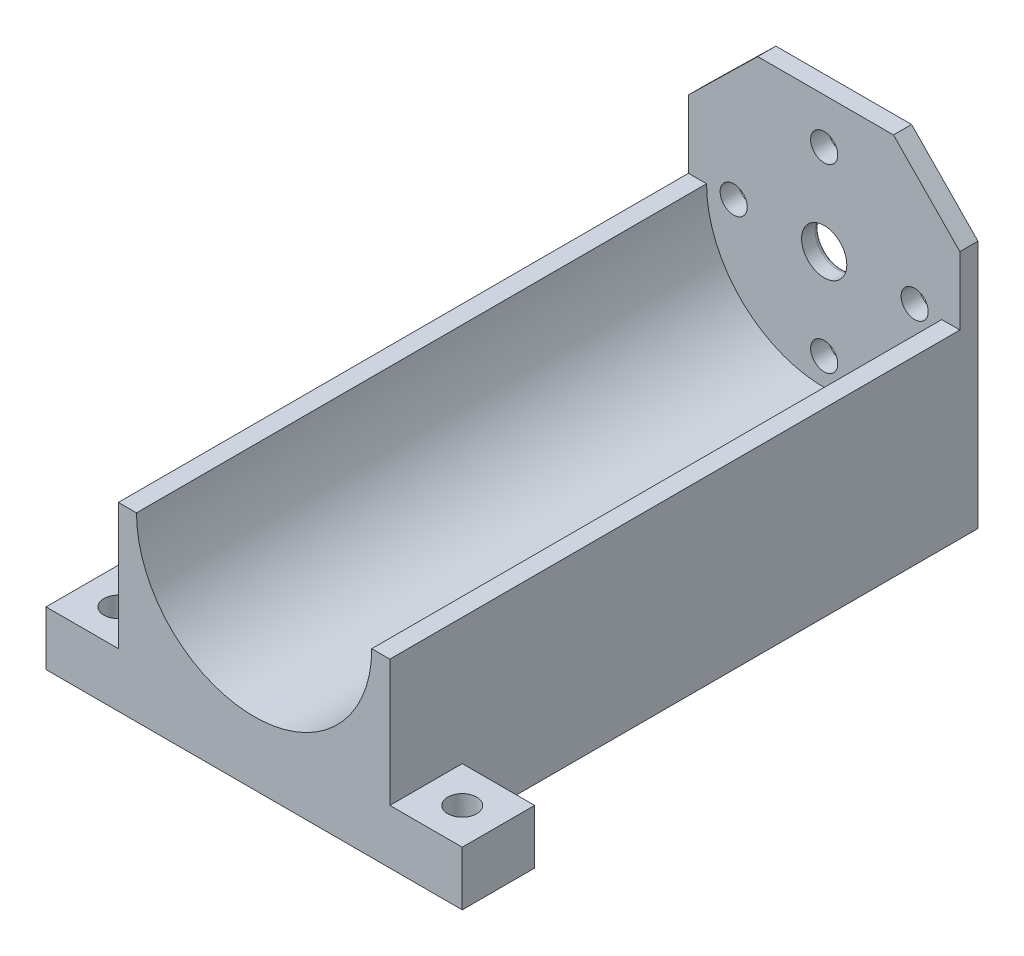
ISO-10303-21;
HEADER;
FILE_DESCRIPTION(('STEP AP214'),'2;1');
FILE_NAME('part.step','',(''),(''),'','','');
FILE_SCHEMA(('AUTOMOTIVE_DESIGN { 1 0 10303 214 1 1 1 1 }'));
ENDSEC;
DATA;
#1=APPLICATION_CONTEXT('core data for automotive mechanical design processes');
#2=APPLICATION_PROTOCOL_DEFINITION('international standard','automotive_design',2000,#1);
#3=PRODUCT_CONTEXT('',#1,'mechanical');
#4=PRODUCT('Part','Part','',(#3));
#5=PRODUCT_RELATED_PRODUCT_CATEGORY('part','',(#4));
#6=PRODUCT_DEFINITION_FORMATION('','',#4);
#7=PRODUCT_DEFINITION_CONTEXT('part definition',#1,'design');
#8=PRODUCT_DEFINITION('design','',#6,#7);
#9=PRODUCT_DEFINITION_SHAPE('','',#8);
#10=(LENGTH_UNIT() NAMED_UNIT(*) SI_UNIT(.MILLI.,.METRE.));
#11=(NAMED_UNIT(*) PLANE_ANGLE_UNIT() SI_UNIT($,.RADIAN.));
#12=(NAMED_UNIT(*) SI_UNIT($,.STERADIAN.) SOLID_ANGLE_UNIT());
#13=UNCERTAINTY_MEASURE_WITH_UNIT(LENGTH_MEASURE(1.E-05),#10,'distance_accuracy_value','');
#14=(GEOMETRIC_REPRESENTATION_CONTEXT(3) GLOBAL_UNCERTAINTY_ASSIGNED_CONTEXT((#13)) GLOBAL_UNIT_ASSIGNED_CONTEXT((#10,
#11,#12)) REPRESENTATION_CONTEXT('',''));
#15=CARTESIAN_POINT('',(0.,0.,0.));
#16=DIRECTION('',(0.,0.,1.));
#17=DIRECTION('',(1.,0.,0.));
#18=AXIS2_PLACEMENT_3D('',#15,#16,#17);
#19=CARTESIAN_POINT('',(15.,0.,2.));
#20=DIRECTION('',(1.,0.,0.));
#21=DIRECTION('',(0.,0.,-1.));
#22=AXIS2_PLACEMENT_3D('',#19,#20,#21);
#23=PLANE('',#22);
#24=DIRECTION('',(0.,0.,1.));
#25=VECTOR('',#24,1.);
#26=CARTESIAN_POINT('',(15.,-14.,0.));
#27=LINE('',#26,#25);
#28=CARTESIAN_POINT('',(15.,-14.,57.));
#29=VERTEX_POINT('',#28);
#30=CARTESIAN_POINT('',(15.,-14.,65.));
#31=VERTEX_POINT('',#30);
#32=EDGE_CURVE('E188',#29,#31,#27,.T.);
#33=ORIENTED_EDGE('',*,*,#32,.F.);
#34=DIRECTION('',(0.,-1.,0.));
#35=VECTOR('',#34,1.);
#36=CARTESIAN_POINT('',(15.,-14.,57.));
#37=LINE('',#36,#35);
#38=CARTESIAN_POINT('',(15.,-20.,57.));
#39=VERTEX_POINT('',#38);
#40=EDGE_CURVE('E191',#29,#39,#37,.T.);
#41=ORIENTED_EDGE('',*,*,#40,.T.);
#42=DIRECTION('',(0.,0.,-1.));
#43=VECTOR('',#42,1.);
#44=CARTESIAN_POINT('',(15.,-20.,65.));
#45=LINE('',#44,#43);
#46=CARTESIAN_POINT('',(15.,-20.,0.));
#47=VERTEX_POINT('',#46);
#48=EDGE_CURVE('E299',#39,#47,#45,.T.);
#49=ORIENTED_EDGE('',*,*,#48,.T.);
#50=DIRECTION('',(0.,-1.,0.));
#51=VECTOR('',#50,1.);
#52=CARTESIAN_POINT('',(15.,0.,0.));
#53=LINE('',#52,#51);
#54=CARTESIAN_POINT('',(15.,7.5,0.));
#55=VERTEX_POINT('',#54);
#56=EDGE_CURVE('E356',#55,#47,#53,.T.);
#57=ORIENTED_EDGE('',*,*,#56,.F.);
#58=DIRECTION('',(0.,0.,-1.));
#59=VECTOR('',#58,1.);
#60=CARTESIAN_POINT('',(15.,7.5,2.));
#61=LINE('',#60,#59);
#62=CARTESIAN_POINT('',(15.,7.5,2.));
#63=VERTEX_POINT('',#62);
#64=EDGE_CURVE('E375',#63,#55,#61,.T.);
#65=ORIENTED_EDGE('',*,*,#64,.F.);
#66=DIRECTION('',(0.,-1.,0.));
#67=VECTOR('',#66,1.);
#68=CARTESIAN_POINT('',(15.,0.,2.));
#69=LINE('',#68,#67);
#70=CARTESIAN_POINT('',(15.,0.,2.));
#71=VERTEX_POINT('',#70);
#72=EDGE_CURVE('E326',#63,#71,#69,.T.);
#73=ORIENTED_EDGE('',*,*,#72,.T.);
#74=DIRECTION('',(0.,0.,-1.));
#75=VECTOR('',#74,1.);
#76=CARTESIAN_POINT('',(15.,0.,65.));
#77=LINE('',#76,#75);
#78=CARTESIAN_POINT('',(15.,0.,65.));
#79=VERTEX_POINT('',#78);
#80=EDGE_CURVE('E301',#79,#71,#77,.T.);
#81=ORIENTED_EDGE('',*,*,#80,.F.);
#82=DIRECTION('',(0.,1.,0.));
#83=VECTOR('',#82,1.);
#84=CARTESIAN_POINT('',(15.,0.,65.));
#85=LINE('',#84,#83);
#86=EDGE_CURVE('E279',#31,#79,#85,.T.);
#87=ORIENTED_EDGE('',*,*,#86,.F.);
#88=EDGE_LOOP('',(#33,#41,#49,#57,#65,#73,#81,#87));
#89=FACE_BOUND('',#88,.T.);
#90=ADVANCED_FACE('F39',(#89),#23,.T.);
#91=CARTESIAN_POINT('',(11.4098237253435,11.1679362653464,2.));
#92=DIRECTION('',(0.714641377388513,0.699491030481627,0.));
#93=DIRECTION('',(-0.699491030481627,0.714641377388513,0.));
#94=AXIS2_PLACEMENT_3D('',#91,#92,#93);
#95=PLANE('',#94);
#96=DIRECTION('',(0.699491030481627,-0.714641377388513,0.));
#97=VECTOR('',#96,1.);
#98=CARTESIAN_POINT('',(11.4098237253435,11.1679362653464,0.));
#99=LINE('',#98,#97);
#100=CARTESIAN_POINT('',(7.65899947217843,15.,0.));
#101=VERTEX_POINT('',#100);
#102=EDGE_CURVE('E359',#101,#55,#99,.T.);
#103=ORIENTED_EDGE('',*,*,#102,.F.);
#104=DIRECTION('',(0.,0.,-1.));
#105=VECTOR('',#104,1.);
#106=CARTESIAN_POINT('',(7.65899947217843,15.,2.));
#107=LINE('',#106,#105);
#108=CARTESIAN_POINT('',(7.65899947217843,15.,2.));
#109=VERTEX_POINT('',#108);
#110=EDGE_CURVE('E373',#109,#101,#107,.T.);
#111=ORIENTED_EDGE('',*,*,#110,.F.);
#112=DIRECTION('',(0.699491030481627,-0.714641377388513,0.));
#113=VECTOR('',#112,1.);
#114=CARTESIAN_POINT('',(11.4098237253435,11.1679362653464,2.));
#115=LINE('',#114,#113);
#116=EDGE_CURVE('E329',#109,#63,#115,.T.);
#117=ORIENTED_EDGE('',*,*,#116,.T.);
#118=ORIENTED_EDGE('',*,*,#64,.T.);
#119=EDGE_LOOP('',(#103,#111,#117,#118));
#120=FACE_BOUND('',#119,.T.);
#121=ADVANCED_FACE('F398',(#120),#95,.T.);
#122=CARTESIAN_POINT('',(0.,15.,2.));
#123=DIRECTION('',(0.,1.,0.));
#124=DIRECTION('',(0.,0.,1.));
#125=AXIS2_PLACEMENT_3D('',#122,#123,#124);
#126=PLANE('',#125);
#127=DIRECTION('',(1.,0.,0.));
#128=VECTOR('',#127,1.);
#129=CARTESIAN_POINT('',(0.,15.,0.));
#130=LINE('',#129,#128);
#131=CARTESIAN_POINT('',(-7.34100052782156,15.,0.));
#132=VERTEX_POINT('',#131);
#133=EDGE_CURVE('E362',#132,#101,#130,.T.);
#134=ORIENTED_EDGE('',*,*,#133,.F.);
#135=DIRECTION('',(0.,0.,-1.));
#136=VECTOR('',#135,1.);
#137=CARTESIAN_POINT('',(-7.34100052782156,15.,2.));
#138=LINE('',#137,#136);
#139=CARTESIAN_POINT('',(-7.34100052782156,15.,2.));
#140=VERTEX_POINT('',#139);
#141=EDGE_CURVE('E371',#140,#132,#138,.T.);
#142=ORIENTED_EDGE('',*,*,#141,.F.);
#143=DIRECTION('',(1.,0.,0.));
#144=VECTOR('',#143,1.);
#145=CARTESIAN_POINT('',(0.,15.,2.));
#146=LINE('',#145,#144);
#147=EDGE_CURVE('E332',#140,#109,#146,.T.);
#148=ORIENTED_EDGE('',*,*,#147,.T.);
#149=ORIENTED_EDGE('',*,*,#110,.T.);
#150=EDGE_LOOP('',(#134,#142,#148,#149));
#151=FACE_BOUND('',#150,.T.);
#152=ADVANCED_FACE('F404',(#151),#126,.T.);
#153=CARTESIAN_POINT('',(-11.0918605271674,11.3270071897403,2.));
#154=DIRECTION('',(-0.699651605960082,0.714484170767609,0.));
#155=DIRECTION('',(-0.714484170767609,-0.699651605960082,0.));
#156=AXIS2_PLACEMENT_3D('',#153,#154,#155);
#157=PLANE('',#156);
#158=DIRECTION('',(0.714484170767609,0.699651605960082,0.));
#159=VECTOR('',#158,1.);
#160=CARTESIAN_POINT('',(-11.0918605271674,11.3270071897403,0.));
#161=LINE('',#160,#159);
#162=CARTESIAN_POINT('',(-15.,7.5,0.));
#163=VERTEX_POINT('',#162);
#164=EDGE_CURVE('E365',#163,#132,#161,.T.);
#165=ORIENTED_EDGE('',*,*,#164,.F.);
#166=DIRECTION('',(0.,0.,-1.));
#167=VECTOR('',#166,1.);
#168=CARTESIAN_POINT('',(-15.,7.5,2.));
#169=LINE('',#168,#167);
#170=CARTESIAN_POINT('',(-15.,7.5,2.));
#171=VERTEX_POINT('',#170);
#172=EDGE_CURVE('E344',#171,#163,#169,.T.);
#173=ORIENTED_EDGE('',*,*,#172,.F.);
#174=DIRECTION('',(0.714484170767609,0.699651605960082,0.));
#175=VECTOR('',#174,1.);
#176=CARTESIAN_POINT('',(-11.0918605271674,11.3270071897403,2.));
#177=LINE('',#176,#175);
#178=EDGE_CURVE('E335',#171,#140,#177,.T.);
#179=ORIENTED_EDGE('',*,*,#178,.T.);
#180=ORIENTED_EDGE('',*,*,#141,.T.);
#181=EDGE_LOOP('',(#165,#173,#179,#180));
#182=FACE_BOUND('',#181,.T.);
#183=ADVANCED_FACE('F469',(#182),#157,.T.);
#184=CARTESIAN_POINT('',(-15.,0.,2.));
#185=DIRECTION('',(-1.,0.,0.));
#186=DIRECTION('',(0.,0.,1.));
#187=AXIS2_PLACEMENT_3D('',#184,#185,#186);
#188=PLANE('',#187);
#189=DIRECTION('',(0.,-1.,0.));
#190=VECTOR('',#189,1.);
#191=CARTESIAN_POINT('',(-15.,-14.,57.));
#192=LINE('',#191,#190);
#193=CARTESIAN_POINT('',(-15.,-14.,57.));
#194=VERTEX_POINT('',#193);
#195=CARTESIAN_POINT('',(-15.,-20.,57.));
#196=VERTEX_POINT('',#195);
#197=EDGE_CURVE('E62',#194,#196,#192,.T.);
#198=ORIENTED_EDGE('',*,*,#197,.F.);
#199=DIRECTION('',(0.,0.,-1.));
#200=VECTOR('',#199,1.);
#201=CARTESIAN_POINT('',(-15.,-14.,0.));
#202=LINE('',#201,#200);
#203=CARTESIAN_POINT('',(-15.,-14.,65.));
#204=VERTEX_POINT('',#203);
#205=EDGE_CURVE('E218',#204,#194,#202,.T.);
#206=ORIENTED_EDGE('',*,*,#205,.F.);
#207=DIRECTION('',(0.,1.,0.));
#208=VECTOR('',#207,1.);
#209=CARTESIAN_POINT('',(-15.,0.,65.));
#210=LINE('',#209,#208);
#211=CARTESIAN_POINT('',(-15.,0.,65.));
#212=VERTEX_POINT('',#211);
#213=EDGE_CURVE('E283',#204,#212,#210,.T.);
#214=ORIENTED_EDGE('',*,*,#213,.T.);
#215=DIRECTION('',(0.,0.,-1.));
#216=VECTOR('',#215,1.);
#217=CARTESIAN_POINT('',(-15.,0.,65.));
#218=LINE('',#217,#216);
#219=CARTESIAN_POINT('',(-15.,0.,2.));
#220=VERTEX_POINT('',#219);
#221=EDGE_CURVE('E294',#212,#220,#218,.T.);
#222=ORIENTED_EDGE('',*,*,#221,.T.);
#223=DIRECTION('',(0.,1.,0.));
#224=VECTOR('',#223,1.);
#225=CARTESIAN_POINT('',(-15.,0.,2.));
#226=LINE('',#225,#224);
#227=EDGE_CURVE('E338',#220,#171,#226,.T.);
#228=ORIENTED_EDGE('',*,*,#227,.T.);
#229=ORIENTED_EDGE('',*,*,#172,.T.);
#230=DIRECTION('',(0.,1.,0.));
#231=VECTOR('',#230,1.);
#232=CARTESIAN_POINT('',(-15.,0.,0.));
#233=LINE('',#232,#231);
#234=CARTESIAN_POINT('',(-15.,-14.,0.));
#235=VERTEX_POINT('',#234);
#236=EDGE_CURVE('E309',#235,#163,#233,.T.);
#237=ORIENTED_EDGE('',*,*,#236,.F.);
#238=DIRECTION('',(0.,0.,-1.));
#239=VECTOR('',#238,1.);
#240=CARTESIAN_POINT('',(-15.,-14.,0.));
#241=LINE('',#240,#239);
#242=CARTESIAN_POINT('',(-15.,-14.,16.));
#243=VERTEX_POINT('',#242);
#244=EDGE_CURVE('E249',#243,#235,#241,.T.);
#245=ORIENTED_EDGE('',*,*,#244,.F.);
#246=DIRECTION('',(0.,-1.,0.));
#247=VECTOR('',#246,1.);
#248=CARTESIAN_POINT('',(-15.,-14.,16.));
#249=LINE('',#248,#247);
#250=CARTESIAN_POINT('',(-15.,-20.,16.));
#251=VERTEX_POINT('',#250);
#252=EDGE_CURVE('E266',#243,#251,#249,.T.);
#253=ORIENTED_EDGE('',*,*,#252,.T.);
#254=DIRECTION('',(0.,0.,-1.));
#255=VECTOR('',#254,1.);
#256=CARTESIAN_POINT('',(-15.,-20.,65.));
#257=LINE('',#256,#255);
#258=EDGE_CURVE('E297',#196,#251,#257,.T.);
#259=ORIENTED_EDGE('',*,*,#258,.F.);
#260=EDGE_LOOP('',(#198,#206,#214,#222,#228,#229,#237,#245,#253,#259));
#261=FACE_BOUND('',#260,.T.);
#262=ADVANCED_FACE('F413',(#261),#188,.T.);
#263=CARTESIAN_POINT('',(0.,10.,2.));
#264=DIRECTION('',(0.,0.,-1.));
#265=DIRECTION('',(-1.,0.,0.));
#266=AXIS2_PLACEMENT_3D('',#263,#264,#265);
#267=CYLINDRICAL_SURFACE('',#266,1.5);
#268=CARTESIAN_POINT('',(0.,10.,2.));
#269=DIRECTION('',(0.,0.,1.));
#270=DIRECTION('',(1.,0.,0.));
#271=AXIS2_PLACEMENT_3D('',#268,#269,#270);
#272=CIRCLE('',#271,1.5);
#273=CARTESIAN_POINT('',(1.5,10.,2.));
#274=VERTEX_POINT('',#273);
#275=EDGE_CURVE('E318',#274,#274,#272,.T.);
#276=ORIENTED_EDGE('',*,*,#275,.T.);
#277=EDGE_LOOP('',(#276));
#278=FACE_BOUND('',#277,.T.);
#279=CARTESIAN_POINT('',(0.,10.,0.));
#280=DIRECTION('',(0.,0.,1.));
#281=DIRECTION('',(1.,0.,0.));
#282=AXIS2_PLACEMENT_3D('',#279,#280,#281);
#283=CIRCLE('',#282,1.5);
#284=CARTESIAN_POINT('',(1.5,10.,0.));
#285=VERTEX_POINT('',#284);
#286=EDGE_CURVE('E353',#285,#285,#283,.T.);
#287=ORIENTED_EDGE('',*,*,#286,.F.);
#288=EDGE_LOOP('',(#287));
#289=FACE_BOUND('',#288,.T.);
#290=ADVANCED_FACE('F409',(#278,#289),#267,.F.);
#291=CARTESIAN_POINT('',(-10.,0.,2.));
#292=DIRECTION('',(0.,0.,-1.));
#293=DIRECTION('',(-1.,0.,0.));
#294=AXIS2_PLACEMENT_3D('',#291,#292,#293);
#295=CYLINDRICAL_SURFACE('',#294,1.5);
#296=CARTESIAN_POINT('',(-10.,0.,2.));
#297=DIRECTION('',(0.,0.,1.));
#298=DIRECTION('',(1.,0.,0.));
#299=AXIS2_PLACEMENT_3D('',#296,#297,#298);
#300=CIRCLE('',#299,1.5);
#301=CARTESIAN_POINT('',(-8.5,0.,2.));
#302=VERTEX_POINT('',#301);
#303=EDGE_CURVE('E315',#302,#302,#300,.T.);
#304=ORIENTED_EDGE('',*,*,#303,.T.);
#305=EDGE_LOOP('',(#304));
#306=FACE_BOUND('',#305,.T.);
#307=CARTESIAN_POINT('',(-10.,0.,0.));
#308=DIRECTION('',(0.,0.,1.));
#309=DIRECTION('',(1.,0.,0.));
#310=AXIS2_PLACEMENT_3D('',#307,#308,#309);
#311=CIRCLE('',#310,1.5);
#312=CARTESIAN_POINT('',(-8.5,0.,0.));
#313=VERTEX_POINT('',#312);
#314=EDGE_CURVE('E350',#313,#313,#311,.T.);
#315=ORIENTED_EDGE('',*,*,#314,.F.);
#316=EDGE_LOOP('',(#315));
#317=FACE_BOUND('',#316,.T.);
#318=ADVANCED_FACE('F412',(#306,#317),#295,.F.);
#319=CARTESIAN_POINT('',(10.,0.,2.));
#320=DIRECTION('',(0.,0.,-1.));
#321=DIRECTION('',(-1.,0.,0.));
#322=AXIS2_PLACEMENT_3D('',#319,#320,#321);
#323=CYLINDRICAL_SURFACE('',#322,1.5);
#324=CARTESIAN_POINT('',(10.,0.,2.));
#325=DIRECTION('',(0.,0.,1.));
#326=DIRECTION('',(1.,0.,0.));
#327=AXIS2_PLACEMENT_3D('',#324,#325,#326);
#328=CIRCLE('',#327,1.5);
#329=CARTESIAN_POINT('',(11.5,0.,2.));
#330=VERTEX_POINT('',#329);
#331=EDGE_CURVE('E312',#330,#330,#328,.T.);
#332=ORIENTED_EDGE('',*,*,#331,.T.);
#333=EDGE_LOOP('',(#332));
#334=FACE_BOUND('',#333,.T.);
#335=CARTESIAN_POINT('',(10.,0.,0.));
#336=DIRECTION('',(0.,0.,1.));
#337=DIRECTION('',(1.,0.,0.));
#338=AXIS2_PLACEMENT_3D('',#335,#336,#337);
#339=CIRCLE('',#338,1.5);
#340=CARTESIAN_POINT('',(11.5,0.,0.));
#341=VERTEX_POINT('',#340);
#342=EDGE_CURVE('E347',#341,#341,#339,.T.);
#343=ORIENTED_EDGE('',*,*,#342,.F.);
#344=EDGE_LOOP('',(#343));
#345=FACE_BOUND('',#344,.T.);
#346=ADVANCED_FACE('F417',(#334,#345),#323,.F.);
#347=CARTESIAN_POINT('',(0.,-10.,2.));
#348=DIRECTION('',(0.,0.,-1.));
#349=DIRECTION('',(-1.,0.,0.));
#350=AXIS2_PLACEMENT_3D('',#347,#348,#349);
#351=CYLINDRICAL_SURFACE('',#350,1.5);
#352=CARTESIAN_POINT('',(0.,-10.,2.));
#353=DIRECTION('',(0.,0.,1.));
#354=DIRECTION('',(1.,0.,0.));
#355=AXIS2_PLACEMENT_3D('',#352,#353,#354);
#356=CIRCLE('',#355,1.5);
#357=CARTESIAN_POINT('',(1.5,-10.,2.));
#358=VERTEX_POINT('',#357);
#359=EDGE_CURVE('E308',#358,#358,#356,.T.);
#360=ORIENTED_EDGE('',*,*,#359,.T.);
#361=EDGE_LOOP('',(#360));
#362=FACE_BOUND('',#361,.T.);
#363=CARTESIAN_POINT('',(0.,-10.,0.));
#364=DIRECTION('',(0.,0.,1.));
#365=DIRECTION('',(1.,0.,0.));
#366=AXIS2_PLACEMENT_3D('',#363,#364,#365);
#367=CIRCLE('',#366,1.5);
#368=CARTESIAN_POINT('',(1.5,-10.,0.));
#369=VERTEX_POINT('',#368);
#370=EDGE_CURVE('E293',#369,#369,#367,.T.);
#371=ORIENTED_EDGE('',*,*,#370,.F.);
#372=EDGE_LOOP('',(#371));
#373=FACE_BOUND('',#372,.T.);
#374=ADVANCED_FACE('F421',(#362,#373),#351,.F.);
#375=CARTESIAN_POINT('',(0.,0.,2.));
#376=DIRECTION('',(0.,0.,-1.));
#377=DIRECTION('',(-1.,0.,0.));
#378=AXIS2_PLACEMENT_3D('',#375,#376,#377);
#379=CYLINDRICAL_SURFACE('',#378,2.5);
#380=CARTESIAN_POINT('',(0.,0.,0.5));
#381=DIRECTION('',(0.,0.,1.));
#382=DIRECTION('',(1.,0.,0.));
#383=AXIS2_PLACEMENT_3D('',#380,#381,#382);
#384=CIRCLE('',#383,2.5);
#385=CARTESIAN_POINT('',(2.5,0.,0.5));
#386=VERTEX_POINT('',#385);
#387=EDGE_CURVE('E11',#386,#386,#384,.F.);
#388=ORIENTED_EDGE('',*,*,#387,.T.);
#389=EDGE_LOOP('',(#388));
#390=FACE_BOUND('',#389,.T.);
#391=CARTESIAN_POINT('',(0.,0.,2.));
#392=DIRECTION('',(0.,0.,1.));
#393=DIRECTION('',(1.,0.,0.));
#394=AXIS2_PLACEMENT_3D('',#391,#392,#393);
#395=CIRCLE('',#394,2.5);
#396=CARTESIAN_POINT('',(2.5,0.,2.));
#397=VERTEX_POINT('',#396);
#398=EDGE_CURVE('E305',#397,#397,#395,.T.);
#399=ORIENTED_EDGE('',*,*,#398,.T.);
#400=EDGE_LOOP('',(#399));
#401=FACE_BOUND('',#400,.T.);
#402=ADVANCED_FACE('F424',(#390,#401),#379,.F.);
#403=CARTESIAN_POINT('',(0.,0.,2.));
#404=DIRECTION('',(0.,0.,1.));
#405=DIRECTION('',(1.,0.,0.));
#406=AXIS2_PLACEMENT_3D('',#403,#404,#405);
#407=PLANE('',#406);
#408=ORIENTED_EDGE('',*,*,#398,.F.);
#409=EDGE_LOOP('',(#408));
#410=FACE_BOUND('',#409,.T.);
#411=ORIENTED_EDGE('',*,*,#359,.F.);
#412=EDGE_LOOP('',(#411));
#413=FACE_BOUND('',#412,.T.);
#414=ORIENTED_EDGE('',*,*,#331,.F.);
#415=EDGE_LOOP('',(#414));
#416=FACE_BOUND('',#415,.T.);
#417=ORIENTED_EDGE('',*,*,#303,.F.);
#418=EDGE_LOOP('',(#417));
#419=FACE_BOUND('',#418,.T.);
#420=ORIENTED_EDGE('',*,*,#275,.F.);
#421=EDGE_LOOP('',(#420));
#422=FACE_BOUND('',#421,.T.);
#423=CARTESIAN_POINT('',(0.,0.,2.));
#424=DIRECTION('',(0.,0.,1.));
#425=DIRECTION('',(1.,0.,0.));
#426=AXIS2_PLACEMENT_3D('',#423,#424,#425);
#427=CIRCLE('',#426,13.);
#428=CARTESIAN_POINT('',(-13.,0.,2.));
#429=VERTEX_POINT('',#428);
#430=CARTESIAN_POINT('',(13.,0.,2.));
#431=VERTEX_POINT('',#430);
#432=EDGE_CURVE('E321',#429,#431,#427,.T.);
#433=ORIENTED_EDGE('',*,*,#432,.T.);
#434=DIRECTION('',(-1.,0.,0.));
#435=VECTOR('',#434,1.);
#436=CARTESIAN_POINT('',(0.,0.,2.));
#437=LINE('',#436,#435);
#438=EDGE_CURVE('E324',#71,#431,#437,.T.);
#439=ORIENTED_EDGE('',*,*,#438,.F.);
#440=ORIENTED_EDGE('',*,*,#72,.F.);
#441=ORIENTED_EDGE('',*,*,#116,.F.);
#442=ORIENTED_EDGE('',*,*,#147,.F.);
#443=ORIENTED_EDGE('',*,*,#178,.F.);
#444=ORIENTED_EDGE('',*,*,#227,.F.);
#445=DIRECTION('',(1.,0.,0.));
#446=VECTOR('',#445,1.);
#447=CARTESIAN_POINT('',(0.,0.,2.));
#448=LINE('',#447,#446);
#449=EDGE_CURVE('E341',#220,#429,#448,.T.);
#450=ORIENTED_EDGE('',*,*,#449,.T.);
#451=EDGE_LOOP('',(#433,#439,#440,#441,#442,#443,#444,#450));
#452=FACE_BOUND('',#451,.T.);
#453=ADVANCED_FACE('F427',(#410,#413,#416,#419,#422,#452),#407,.T.);
#454=CARTESIAN_POINT('',(0.,0.,0.));
#455=DIRECTION('',(0.,0.,1.));
#456=DIRECTION('',(1.,0.,0.));
#457=AXIS2_PLACEMENT_3D('',#454,#455,#456);
#458=PLANE('',#457);
#459=CARTESIAN_POINT('',(0.,0.,0.));
#460=DIRECTION('',(0.,0.,1.));
#461=DIRECTION('',(1.,0.,0.));
#462=AXIS2_PLACEMENT_3D('',#459,#460,#461);
#463=CIRCLE('',#462,3.);
#464=CARTESIAN_POINT('',(3.,0.,0.));
#465=VERTEX_POINT('',#464);
#466=EDGE_CURVE('E47',#465,#465,#463,.T.);
#467=ORIENTED_EDGE('',*,*,#466,.T.);
#468=EDGE_LOOP('',(#467));
#469=FACE_BOUND('',#468,.T.);
#470=ORIENTED_EDGE('',*,*,#370,.T.);
#471=EDGE_LOOP('',(#470));
#472=FACE_BOUND('',#471,.T.);
#473=ORIENTED_EDGE('',*,*,#342,.T.);
#474=EDGE_LOOP('',(#473));
#475=FACE_BOUND('',#474,.T.);
#476=ORIENTED_EDGE('',*,*,#314,.T.);
#477=EDGE_LOOP('',(#476));
#478=FACE_BOUND('',#477,.T.);
#479=ORIENTED_EDGE('',*,*,#286,.T.);
#480=EDGE_LOOP('',(#479));
#481=FACE_BOUND('',#480,.T.);
#482=DIRECTION('',(-1.,0.,0.));
#483=VECTOR('',#482,1.);
#484=CARTESIAN_POINT('',(0.,-20.,0.));
#485=LINE('',#484,#483);
#486=CARTESIAN_POINT('',(-23.,-20.,0.));
#487=VERTEX_POINT('',#486);
#488=EDGE_CURVE('E269',#47,#487,#485,.T.);
#489=ORIENTED_EDGE('',*,*,#488,.T.);
#490=DIRECTION('',(0.,-1.,0.));
#491=VECTOR('',#490,1.);
#492=CARTESIAN_POINT('',(-23.,-14.,0.));
#493=LINE('',#492,#491);
#494=CARTESIAN_POINT('',(-23.,-14.,0.));
#495=VERTEX_POINT('',#494);
#496=EDGE_CURVE('E270',#495,#487,#493,.T.);
#497=ORIENTED_EDGE('',*,*,#496,.F.);
#498=DIRECTION('',(-1.,0.,0.));
#499=VECTOR('',#498,1.);
#500=CARTESIAN_POINT('',(0.,-14.,0.));
#501=LINE('',#500,#499);
#502=EDGE_CURVE('E247',#235,#495,#501,.T.);
#503=ORIENTED_EDGE('',*,*,#502,.F.);
#504=ORIENTED_EDGE('',*,*,#236,.T.);
#505=ORIENTED_EDGE('',*,*,#164,.T.);
#506=ORIENTED_EDGE('',*,*,#133,.T.);
#507=ORIENTED_EDGE('',*,*,#102,.T.);
#508=ORIENTED_EDGE('',*,*,#56,.T.);
#509=EDGE_LOOP('',(#489,#497,#503,#504,#505,#506,#507,#508));
#510=FACE_BOUND('',#509,.T.);
#511=ADVANCED_FACE('F379',(#469,#472,#475,#478,#481,#510),#458,.F.);
#512=CARTESIAN_POINT('',(0.,0.,65.));
#513=DIRECTION('',(0.,0.,-1.));
#514=DIRECTION('',(-1.,0.,0.));
#515=AXIS2_PLACEMENT_3D('',#512,#513,#514);
#516=CYLINDRICAL_SURFACE('',#515,13.);
#517=ORIENTED_EDGE('',*,*,#432,.F.);
#518=DIRECTION('',(0.,0.,-1.));
#519=VECTOR('',#518,1.);
#520=CARTESIAN_POINT('',(-13.,0.,65.));
#521=LINE('',#520,#519);
#522=CARTESIAN_POINT('',(-13.,0.,65.));
#523=VERTEX_POINT('',#522);
#524=EDGE_CURVE('E290',#523,#429,#521,.T.);
#525=ORIENTED_EDGE('',*,*,#524,.F.);
#526=CARTESIAN_POINT('',(0.,0.,65.));
#527=DIRECTION('',(0.,0.,-1.));
#528=DIRECTION('',(-1.,0.,0.));
#529=AXIS2_PLACEMENT_3D('',#526,#527,#528);
#530=CIRCLE('',#529,13.);
#531=CARTESIAN_POINT('',(13.,0.,65.));
#532=VERTEX_POINT('',#531);
#533=EDGE_CURVE('E274',#532,#523,#530,.T.);
#534=ORIENTED_EDGE('',*,*,#533,.F.);
#535=DIRECTION('',(0.,0.,-1.));
#536=VECTOR('',#535,1.);
#537=CARTESIAN_POINT('',(13.,0.,65.));
#538=LINE('',#537,#536);
#539=EDGE_CURVE('E288',#532,#431,#538,.T.);
#540=ORIENTED_EDGE('',*,*,#539,.T.);
#541=EDGE_LOOP('',(#517,#525,#534,#540));
#542=FACE_BOUND('',#541,.T.);
#543=ADVANCED_FACE('F450',(#542),#516,.F.);
#544=CARTESIAN_POINT('',(0.,0.,65.));
#545=DIRECTION('',(0.,-1.,0.));
#546=DIRECTION('',(0.,0.,-1.));
#547=AXIS2_PLACEMENT_3D('',#544,#545,#546);
#548=PLANE('',#547);
#549=ORIENTED_EDGE('',*,*,#449,.F.);
#550=ORIENTED_EDGE('',*,*,#221,.F.);
#551=DIRECTION('',(-1.,0.,0.));
#552=VECTOR('',#551,1.);
#553=CARTESIAN_POINT('',(0.,0.,65.));
#554=LINE('',#553,#552);
#555=EDGE_CURVE('E285',#523,#212,#554,.T.);
#556=ORIENTED_EDGE('',*,*,#555,.F.);
#557=ORIENTED_EDGE('',*,*,#524,.T.);
#558=EDGE_LOOP('',(#549,#550,#556,#557));
#559=FACE_BOUND('',#558,.T.);
#560=ADVANCED_FACE('F454',(#559),#548,.F.);
#561=CARTESIAN_POINT('',(0.,-20.,65.));
#562=DIRECTION('',(0.,-1.,0.));
#563=DIRECTION('',(0.,0.,-1.));
#564=AXIS2_PLACEMENT_3D('',#561,#562,#563);
#565=PLANE('',#564);
#566=ORIENTED_EDGE('',*,*,#488,.F.);
#567=ORIENTED_EDGE('',*,*,#48,.F.);
#568=DIRECTION('',(-1.,0.,0.));
#569=VECTOR('',#568,1.);
#570=CARTESIAN_POINT('',(0.,-20.,57.));
#571=LINE('',#570,#569);
#572=CARTESIAN_POINT('',(23.,-20.,57.));
#573=VERTEX_POINT('',#572);
#574=EDGE_CURVE('E54',#573,#39,#571,.T.);
#575=ORIENTED_EDGE('',*,*,#574,.F.);
#576=DIRECTION('',(0.,0.,-1.));
#577=VECTOR('',#576,1.);
#578=CARTESIAN_POINT('',(23.,-20.,0.));
#579=LINE('',#578,#577);
#580=CARTESIAN_POINT('',(23.,-20.,65.));
#581=VERTEX_POINT('',#580);
#582=EDGE_CURVE('E186',#581,#573,#579,.T.);
#583=ORIENTED_EDGE('',*,*,#582,.F.);
#584=DIRECTION('',(-1.,0.,0.));
#585=VECTOR('',#584,1.);
#586=CARTESIAN_POINT('',(0.,-20.,65.));
#587=LINE('',#586,#585);
#588=CARTESIAN_POINT('',(-23.,-20.,65.));
#589=VERTEX_POINT('',#588);
#590=EDGE_CURVE('E281',#581,#589,#587,.T.);
#591=ORIENTED_EDGE('',*,*,#590,.T.);
#592=DIRECTION('',(0.,0.,-1.));
#593=VECTOR('',#592,1.);
#594=CARTESIAN_POINT('',(-23.,-20.,0.));
#595=LINE('',#594,#593);
#596=CARTESIAN_POINT('',(-23.,-20.,57.));
#597=VERTEX_POINT('',#596);
#598=EDGE_CURVE('E226',#589,#597,#595,.T.);
#599=ORIENTED_EDGE('',*,*,#598,.T.);
#600=DIRECTION('',(1.,0.,0.));
#601=VECTOR('',#600,1.);
#602=CARTESIAN_POINT('',(0.,-20.,57.));
#603=LINE('',#602,#601);
#604=EDGE_CURVE('E212',#597,#196,#603,.T.);
#605=ORIENTED_EDGE('',*,*,#604,.T.);
#606=ORIENTED_EDGE('',*,*,#258,.T.);
#607=DIRECTION('',(-1.,0.,0.));
#608=VECTOR('',#607,1.);
#609=CARTESIAN_POINT('',(0.,-20.,16.));
#610=LINE('',#609,#608);
#611=CARTESIAN_POINT('',(-23.,-20.,16.));
#612=VERTEX_POINT('',#611);
#613=EDGE_CURVE('E258',#251,#612,#610,.T.);
#614=ORIENTED_EDGE('',*,*,#613,.T.);
#615=DIRECTION('',(0.,0.,-1.));
#616=VECTOR('',#615,1.);
#617=CARTESIAN_POINT('',(-23.,-20.,0.));
#618=LINE('',#617,#616);
#619=EDGE_CURVE('E261',#612,#487,#618,.T.);
#620=ORIENTED_EDGE('',*,*,#619,.T.);
#621=EDGE_LOOP('',(#566,#567,#575,#583,#591,#599,#605,#606,#614,#620));
#622=FACE_BOUND('',#621,.T.);
#623=CARTESIAN_POINT('',(-19.,-20.,12.));
#624=DIRECTION('',(0.,-1.,0.));
#625=DIRECTION('',(0.,0.,-1.));
#626=AXIS2_PLACEMENT_3D('',#623,#624,#625);
#627=CIRCLE('',#626,1.6);
#628=CARTESIAN_POINT('',(-19.,-20.,10.4));
#629=VERTEX_POINT('',#628);
#630=EDGE_CURVE('E234',#629,#629,#627,.T.);
#631=ORIENTED_EDGE('',*,*,#630,.F.);
#632=EDGE_LOOP('',(#631));
#633=FACE_BOUND('',#632,.T.);
#634=CARTESIAN_POINT('',(-19.,-20.,4.));
#635=DIRECTION('',(0.,-1.,0.));
#636=DIRECTION('',(0.,0.,-1.));
#637=AXIS2_PLACEMENT_3D('',#634,#635,#636);
#638=CIRCLE('',#637,1.6);
#639=CARTESIAN_POINT('',(-19.,-20.,2.4));
#640=VERTEX_POINT('',#639);
#641=EDGE_CURVE('E241',#640,#640,#638,.T.);
#642=ORIENTED_EDGE('',*,*,#641,.F.);
#643=EDGE_LOOP('',(#642));
#644=FACE_BOUND('',#643,.T.);
#645=CARTESIAN_POINT('',(-19.,-20.,61.));
#646=DIRECTION('',(0.,-1.,0.));
#647=DIRECTION('',(0.,0.,-1.));
#648=AXIS2_PLACEMENT_3D('',#645,#646,#647);
#649=CIRCLE('',#648,1.6);
#650=CARTESIAN_POINT('',(-19.,-20.,59.4));
#651=VERTEX_POINT('',#650);
#652=EDGE_CURVE('E206',#651,#651,#649,.T.);
#653=ORIENTED_EDGE('',*,*,#652,.F.);
#654=EDGE_LOOP('',(#653));
#655=FACE_BOUND('',#654,.T.);
#656=CARTESIAN_POINT('',(19.,-20.,61.));
#657=DIRECTION('',(0.,-1.,0.));
#658=DIRECTION('',(0.,0.,-1.));
#659=AXIS2_PLACEMENT_3D('',#656,#657,#658);
#660=CIRCLE('',#659,1.6);
#661=CARTESIAN_POINT('',(19.,-20.,59.4));
#662=VERTEX_POINT('',#661);
#663=EDGE_CURVE('E200',#662,#662,#660,.T.);
#664=ORIENTED_EDGE('',*,*,#663,.F.);
#665=EDGE_LOOP('',(#664));
#666=FACE_BOUND('',#665,.T.);
#667=ADVANCED_FACE('F483',(#622,#633,#644,#655,#666),#565,.T.);
#668=CARTESIAN_POINT('',(0.,0.,65.));
#669=DIRECTION('',(0.,-1.,0.));
#670=DIRECTION('',(0.,0.,-1.));
#671=AXIS2_PLACEMENT_3D('',#668,#669,#670);
#672=PLANE('',#671);
#673=ORIENTED_EDGE('',*,*,#438,.T.);
#674=ORIENTED_EDGE('',*,*,#539,.F.);
#675=DIRECTION('',(-1.,0.,0.));
#676=VECTOR('',#675,1.);
#677=CARTESIAN_POINT('',(0.,0.,65.));
#678=LINE('',#677,#676);
#679=EDGE_CURVE('E277',#79,#532,#678,.T.);
#680=ORIENTED_EDGE('',*,*,#679,.F.);
#681=ORIENTED_EDGE('',*,*,#80,.T.);
#682=EDGE_LOOP('',(#673,#674,#680,#681));
#683=FACE_BOUND('',#682,.T.);
#684=ADVANCED_FACE('F393',(#683),#672,.F.);
#685=CARTESIAN_POINT('',(0.,0.,65.));
#686=DIRECTION('',(0.,0.,-1.));
#687=DIRECTION('',(-1.,0.,0.));
#688=AXIS2_PLACEMENT_3D('',#685,#686,#687);
#689=PLANE('',#688);
#690=ORIENTED_EDGE('',*,*,#533,.T.);
#691=ORIENTED_EDGE('',*,*,#555,.T.);
#692=ORIENTED_EDGE('',*,*,#213,.F.);
#693=DIRECTION('',(-1.,0.,0.));
#694=VECTOR('',#693,1.);
#695=CARTESIAN_POINT('',(0.,-14.,65.));
#696=LINE('',#695,#694);
#697=CARTESIAN_POINT('',(-23.,-14.,65.));
#698=VERTEX_POINT('',#697);
#699=EDGE_CURVE('E220',#204,#698,#696,.T.);
#700=ORIENTED_EDGE('',*,*,#699,.T.);
#701=DIRECTION('',(0.,-1.,0.));
#702=VECTOR('',#701,1.);
#703=CARTESIAN_POINT('',(-23.,-14.,65.));
#704=LINE('',#703,#702);
#705=EDGE_CURVE('E231',#698,#589,#704,.T.);
#706=ORIENTED_EDGE('',*,*,#705,.T.);
#707=ORIENTED_EDGE('',*,*,#590,.F.);
#708=DIRECTION('',(0.,-1.,0.));
#709=VECTOR('',#708,1.);
#710=CARTESIAN_POINT('',(23.,-14.,65.));
#711=LINE('',#710,#709);
#712=CARTESIAN_POINT('',(23.,-14.,65.));
#713=VERTEX_POINT('',#712);
#714=EDGE_CURVE('E187',#713,#581,#711,.T.);
#715=ORIENTED_EDGE('',*,*,#714,.F.);
#716=DIRECTION('',(1.,0.,0.));
#717=VECTOR('',#716,1.);
#718=CARTESIAN_POINT('',(0.,-14.,65.));
#719=LINE('',#718,#717);
#720=EDGE_CURVE('E178',#31,#713,#719,.T.);
#721=ORIENTED_EDGE('',*,*,#720,.F.);
#722=ORIENTED_EDGE('',*,*,#86,.T.);
#723=ORIENTED_EDGE('',*,*,#679,.T.);
#724=EDGE_LOOP('',(#690,#691,#692,#700,#706,#707,#715,#721,#722,#723));
#725=FACE_BOUND('',#724,.T.);
#726=ADVANCED_FACE('F384',(#725),#689,.F.);
#727=CARTESIAN_POINT('',(0.,0.,0.5));
#728=DIRECTION('',(0.,0.,1.));
#729=DIRECTION('',(1.,0.,0.));
#730=AXIS2_PLACEMENT_3D('',#727,#728,#729);
#731=TOROIDAL_SURFACE('',#730,3.,0.5);
#732=ORIENTED_EDGE('',*,*,#387,.F.);
#733=EDGE_LOOP('',(#732));
#734=FACE_BOUND('',#733,.T.);
#735=ORIENTED_EDGE('',*,*,#466,.F.);
#736=EDGE_LOOP('',(#735));
#737=FACE_BOUND('',#736,.T.);
#738=ADVANCED_FACE('F41',(#734,#737),#731,.T.);
#739=CARTESIAN_POINT('',(0.,-14.,16.));
#740=DIRECTION('',(0.,0.,1.));
#741=DIRECTION('',(1.,0.,0.));
#742=AXIS2_PLACEMENT_3D('',#739,#740,#741);
#743=PLANE('',#742);
#744=ORIENTED_EDGE('',*,*,#613,.F.);
#745=ORIENTED_EDGE('',*,*,#252,.F.);
#746=DIRECTION('',(-1.,0.,0.));
#747=VECTOR('',#746,1.);
#748=CARTESIAN_POINT('',(0.,-14.,16.));
#749=LINE('',#748,#747);
#750=CARTESIAN_POINT('',(-23.,-14.,16.));
#751=VERTEX_POINT('',#750);
#752=EDGE_CURVE('E240',#243,#751,#749,.T.);
#753=ORIENTED_EDGE('',*,*,#752,.T.);
#754=DIRECTION('',(0.,-1.,0.));
#755=VECTOR('',#754,1.);
#756=CARTESIAN_POINT('',(-23.,-14.,16.));
#757=LINE('',#756,#755);
#758=EDGE_CURVE('E255',#751,#612,#757,.T.);
#759=ORIENTED_EDGE('',*,*,#758,.T.);
#760=EDGE_LOOP('',(#744,#745,#753,#759));
#761=FACE_BOUND('',#760,.T.);
#762=ADVANCED_FACE('F383',(#761),#743,.T.);
#763=CARTESIAN_POINT('',(-23.,-14.,0.));
#764=DIRECTION('',(-1.,0.,0.));
#765=DIRECTION('',(0.,0.,1.));
#766=AXIS2_PLACEMENT_3D('',#763,#764,#765);
#767=PLANE('',#766);
#768=ORIENTED_EDGE('',*,*,#619,.F.);
#769=ORIENTED_EDGE('',*,*,#758,.F.);
#770=DIRECTION('',(0.,0.,-1.));
#771=VECTOR('',#770,1.);
#772=CARTESIAN_POINT('',(-23.,-14.,0.));
#773=LINE('',#772,#771);
#774=EDGE_CURVE('E244',#751,#495,#773,.T.);
#775=ORIENTED_EDGE('',*,*,#774,.T.);
#776=ORIENTED_EDGE('',*,*,#496,.T.);
#777=EDGE_LOOP('',(#768,#769,#775,#776));
#778=FACE_BOUND('',#777,.T.);
#779=ADVANCED_FACE('F390',(#778),#767,.T.);
#780=CARTESIAN_POINT('',(-19.,-14.,12.));
#781=DIRECTION('',(0.,-1.,0.));
#782=DIRECTION('',(0.,0.,-1.));
#783=AXIS2_PLACEMENT_3D('',#780,#781,#782);
#784=CYLINDRICAL_SURFACE('',#783,1.6);
#785=CARTESIAN_POINT('',(-19.,-14.,12.));
#786=DIRECTION('',(0.,-1.,0.));
#787=DIRECTION('',(0.,0.,-1.));
#788=AXIS2_PLACEMENT_3D('',#785,#786,#787);
#789=CIRCLE('',#788,1.6);
#790=CARTESIAN_POINT('',(-19.,-14.,10.4));
#791=VERTEX_POINT('',#790);
#792=EDGE_CURVE('E237',#791,#791,#789,.T.);
#793=ORIENTED_EDGE('',*,*,#792,.F.);
#794=EDGE_LOOP('',(#793));
#795=FACE_BOUND('',#794,.T.);
#796=ORIENTED_EDGE('',*,*,#630,.T.);
#797=EDGE_LOOP('',(#796));
#798=FACE_BOUND('',#797,.T.);
#799=ADVANCED_FACE('F497',(#795,#798),#784,.F.);
#800=CARTESIAN_POINT('',(-19.,-14.,4.));
#801=DIRECTION('',(0.,-1.,0.));
#802=DIRECTION('',(0.,0.,-1.));
#803=AXIS2_PLACEMENT_3D('',#800,#801,#802);
#804=CYLINDRICAL_SURFACE('',#803,1.6);
#805=CARTESIAN_POINT('',(-19.,-14.,4.));
#806=DIRECTION('',(0.,-1.,0.));
#807=DIRECTION('',(0.,0.,-1.));
#808=AXIS2_PLACEMENT_3D('',#805,#806,#807);
#809=CIRCLE('',#808,1.6);
#810=CARTESIAN_POINT('',(-19.,-14.,2.4));
#811=VERTEX_POINT('',#810);
#812=EDGE_CURVE('E252',#811,#811,#809,.T.);
#813=ORIENTED_EDGE('',*,*,#812,.F.);
#814=EDGE_LOOP('',(#813));
#815=FACE_BOUND('',#814,.T.);
#816=ORIENTED_EDGE('',*,*,#641,.T.);
#817=EDGE_LOOP('',(#816));
#818=FACE_BOUND('',#817,.T.);
#819=ADVANCED_FACE('F502',(#815,#818),#804,.F.);
#820=CARTESIAN_POINT('',(0.,-14.,0.));
#821=DIRECTION('',(0.,-1.,0.));
#822=DIRECTION('',(0.,0.,-1.));
#823=AXIS2_PLACEMENT_3D('',#820,#821,#822);
#824=PLANE('',#823);
#825=ORIENTED_EDGE('',*,*,#792,.T.);
#826=EDGE_LOOP('',(#825));
#827=FACE_BOUND('',#826,.T.);
#828=ORIENTED_EDGE('',*,*,#752,.F.);
#829=ORIENTED_EDGE('',*,*,#244,.T.);
#830=ORIENTED_EDGE('',*,*,#502,.T.);
#831=ORIENTED_EDGE('',*,*,#774,.F.);
#832=EDGE_LOOP('',(#828,#829,#830,#831));
#833=FACE_BOUND('',#832,.T.);
#834=ORIENTED_EDGE('',*,*,#812,.T.);
#835=EDGE_LOOP('',(#834));
#836=FACE_BOUND('',#835,.T.);
#837=ADVANCED_FACE('F491',(#827,#833,#836),#824,.F.);
#838=CARTESIAN_POINT('',(-23.,-14.,0.));
#839=DIRECTION('',(-1.,0.,0.));
#840=DIRECTION('',(0.,0.,1.));
#841=AXIS2_PLACEMENT_3D('',#838,#839,#840);
#842=PLANE('',#841);
#843=ORIENTED_EDGE('',*,*,#598,.F.);
#844=ORIENTED_EDGE('',*,*,#705,.F.);
#845=DIRECTION('',(0.,0.,-1.));
#846=VECTOR('',#845,1.);
#847=CARTESIAN_POINT('',(-23.,-14.,0.));
#848=LINE('',#847,#846);
#849=CARTESIAN_POINT('',(-23.,-14.,57.));
#850=VERTEX_POINT('',#849);
#851=EDGE_CURVE('E211',#698,#850,#848,.T.);
#852=ORIENTED_EDGE('',*,*,#851,.T.);
#853=DIRECTION('',(0.,-1.,0.));
#854=VECTOR('',#853,1.);
#855=CARTESIAN_POINT('',(-23.,-14.,57.));
#856=LINE('',#855,#854);
#857=EDGE_CURVE('E223',#850,#597,#856,.T.);
#858=ORIENTED_EDGE('',*,*,#857,.T.);
#859=EDGE_LOOP('',(#843,#844,#852,#858));
#860=FACE_BOUND('',#859,.T.);
#861=ADVANCED_FACE('F479',(#860),#842,.T.);
#862=CARTESIAN_POINT('',(-19.,-14.,61.));
#863=DIRECTION('',(0.,-1.,0.));
#864=DIRECTION('',(0.,0.,-1.));
#865=AXIS2_PLACEMENT_3D('',#862,#863,#864);
#866=CYLINDRICAL_SURFACE('',#865,1.6);
#867=CARTESIAN_POINT('',(-19.,-14.,61.));
#868=DIRECTION('',(0.,-1.,0.));
#869=DIRECTION('',(0.,0.,-1.));
#870=AXIS2_PLACEMENT_3D('',#867,#868,#869);
#871=CIRCLE('',#870,1.6);
#872=CARTESIAN_POINT('',(-19.,-14.,59.4));
#873=VERTEX_POINT('',#872);
#874=EDGE_CURVE('E208',#873,#873,#871,.T.);
#875=ORIENTED_EDGE('',*,*,#874,.F.);
#876=EDGE_LOOP('',(#875));
#877=FACE_BOUND('',#876,.T.);
#878=ORIENTED_EDGE('',*,*,#652,.T.);
#879=EDGE_LOOP('',(#878));
#880=FACE_BOUND('',#879,.T.);
#881=ADVANCED_FACE('F701',(#877,#880),#866,.F.);
#882=CARTESIAN_POINT('',(0.,-14.,57.));
#883=DIRECTION('',(0.,0.,-1.));
#884=DIRECTION('',(-1.,0.,0.));
#885=AXIS2_PLACEMENT_3D('',#882,#883,#884);
#886=PLANE('',#885);
#887=ORIENTED_EDGE('',*,*,#604,.F.);
#888=ORIENTED_EDGE('',*,*,#857,.F.);
#889=DIRECTION('',(1.,0.,0.));
#890=VECTOR('',#889,1.);
#891=CARTESIAN_POINT('',(0.,-14.,57.));
#892=LINE('',#891,#890);
#893=EDGE_CURVE('E215',#850,#194,#892,.T.);
#894=ORIENTED_EDGE('',*,*,#893,.T.);
#895=ORIENTED_EDGE('',*,*,#197,.T.);
#896=EDGE_LOOP('',(#887,#888,#894,#895));
#897=FACE_BOUND('',#896,.T.);
#898=ADVANCED_FACE('F709',(#897),#886,.T.);
#899=CARTESIAN_POINT('',(0.,-14.,0.));
#900=DIRECTION('',(0.,-1.,0.));
#901=DIRECTION('',(0.,0.,-1.));
#902=AXIS2_PLACEMENT_3D('',#899,#900,#901);
#903=PLANE('',#902);
#904=ORIENTED_EDGE('',*,*,#874,.T.);
#905=EDGE_LOOP('',(#904));
#906=FACE_BOUND('',#905,.T.);
#907=ORIENTED_EDGE('',*,*,#851,.F.);
#908=ORIENTED_EDGE('',*,*,#699,.F.);
#909=ORIENTED_EDGE('',*,*,#205,.T.);
#910=ORIENTED_EDGE('',*,*,#893,.F.);
#911=EDGE_LOOP('',(#907,#908,#909,#910));
#912=FACE_BOUND('',#911,.T.);
#913=ADVANCED_FACE('F476',(#906,#912),#903,.F.);
#914=CARTESIAN_POINT('',(0.,-14.,57.));
#915=DIRECTION('',(0.,0.,1.));
#916=DIRECTION('',(1.,0.,0.));
#917=AXIS2_PLACEMENT_3D('',#914,#915,#916);
#918=PLANE('',#917);
#919=ORIENTED_EDGE('',*,*,#574,.T.);
#920=ORIENTED_EDGE('',*,*,#40,.F.);
#921=DIRECTION('',(-1.,0.,0.));
#922=VECTOR('',#921,1.);
#923=CARTESIAN_POINT('',(0.,-14.,57.));
#924=LINE('',#923,#922);
#925=CARTESIAN_POINT('',(23.,-14.,57.));
#926=VERTEX_POINT('',#925);
#927=EDGE_CURVE('E176',#926,#29,#924,.T.);
#928=ORIENTED_EDGE('',*,*,#927,.F.);
#929=DIRECTION('',(0.,-1.,0.));
#930=VECTOR('',#929,1.);
#931=CARTESIAN_POINT('',(23.,-14.,57.));
#932=LINE('',#931,#930);
#933=EDGE_CURVE('E183',#926,#573,#932,.T.);
#934=ORIENTED_EDGE('',*,*,#933,.T.);
#935=EDGE_LOOP('',(#919,#920,#928,#934));
#936=FACE_BOUND('',#935,.T.);
#937=ADVANCED_FACE('F190',(#936),#918,.F.);
#938=CARTESIAN_POINT('',(19.,-14.,61.));
#939=DIRECTION('',(0.,-1.,0.));
#940=DIRECTION('',(0.,0.,-1.));
#941=AXIS2_PLACEMENT_3D('',#938,#939,#940);
#942=CYLINDRICAL_SURFACE('',#941,1.6);
#943=CARTESIAN_POINT('',(19.,-14.,61.));
#944=DIRECTION('',(0.,-1.,0.));
#945=DIRECTION('',(0.,0.,-1.));
#946=AXIS2_PLACEMENT_3D('',#943,#944,#945);
#947=CIRCLE('',#946,1.6);
#948=CARTESIAN_POINT('',(19.,-14.,59.4));
#949=VERTEX_POINT('',#948);
#950=EDGE_CURVE('E193',#949,#949,#947,.T.);
#951=ORIENTED_EDGE('',*,*,#950,.F.);
#952=EDGE_LOOP('',(#951));
#953=FACE_BOUND('',#952,.T.);
#954=ORIENTED_EDGE('',*,*,#663,.T.);
#955=EDGE_LOOP('',(#954));
#956=FACE_BOUND('',#955,.T.);
#957=ADVANCED_FACE('F734',(#953,#956),#942,.F.);
#958=CARTESIAN_POINT('',(23.,-14.,0.));
#959=DIRECTION('',(-1.,0.,0.));
#960=DIRECTION('',(0.,0.,1.));
#961=AXIS2_PLACEMENT_3D('',#958,#959,#960);
#962=PLANE('',#961);
#963=ORIENTED_EDGE('',*,*,#582,.T.);
#964=ORIENTED_EDGE('',*,*,#933,.F.);
#965=DIRECTION('',(0.,0.,-1.));
#966=VECTOR('',#965,1.);
#967=CARTESIAN_POINT('',(23.,-14.,0.));
#968=LINE('',#967,#966);
#969=EDGE_CURVE('E172',#713,#926,#968,.T.);
#970=ORIENTED_EDGE('',*,*,#969,.F.);
#971=ORIENTED_EDGE('',*,*,#714,.T.);
#972=EDGE_LOOP('',(#963,#964,#970,#971));
#973=FACE_BOUND('',#972,.T.);
#974=ADVANCED_FACE('F184',(#973),#962,.F.);
#975=CARTESIAN_POINT('',(0.,-14.,0.));
#976=DIRECTION('',(0.,-1.,0.));
#977=DIRECTION('',(0.,0.,-1.));
#978=AXIS2_PLACEMENT_3D('',#975,#976,#977);
#979=PLANE('',#978);
#980=ORIENTED_EDGE('',*,*,#950,.T.);
#981=EDGE_LOOP('',(#980));
#982=FACE_BOUND('',#981,.T.);
#983=ORIENTED_EDGE('',*,*,#927,.T.);
#984=ORIENTED_EDGE('',*,*,#32,.T.);
#985=ORIENTED_EDGE('',*,*,#720,.T.);
#986=ORIENTED_EDGE('',*,*,#969,.T.);
#987=EDGE_LOOP('',(#983,#984,#985,#986));
#988=FACE_BOUND('',#987,.T.);
#989=ADVANCED_FACE('F174',(#982,#988),#979,.F.);
#990=CLOSED_SHELL('',(#90,#121,#152,#183,#262,#290,#318,#346,#374,#402,#453,#511,#543,#560,#667,
#684,#726,#738,#762,#779,#799,#819,#837,#861,#881,#898,#913,#937,#957,#974,#989));
#991=MANIFOLD_SOLID_BREP('B2',#990);
#992=ADVANCED_BREP_SHAPE_REPRESENTATION('',(#18,#991),#14);
#993=SHAPE_DEFINITION_REPRESENTATION(#9,#992);
ENDSEC;
END-ISO-10303-21;
